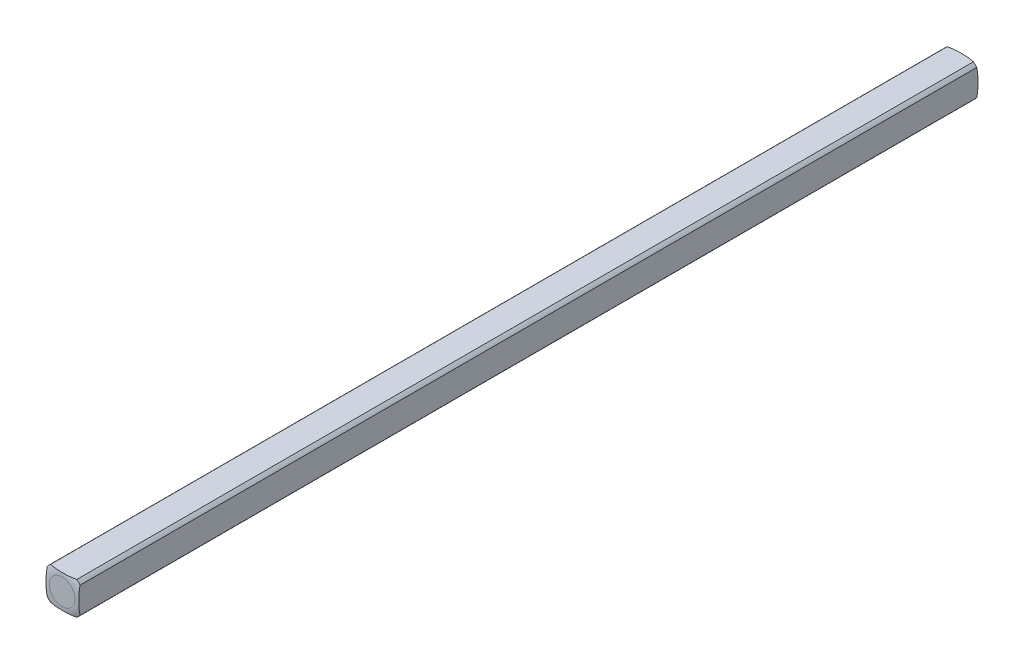
ISO-10303-21;
HEADER;
FILE_DESCRIPTION(('STEP AP214'),'2;1');
FILE_NAME('part.step','',(''),(''),'','','');
FILE_SCHEMA(('AUTOMOTIVE_DESIGN { 1 0 10303 214 1 1 1 1 }'));
ENDSEC;
DATA;
#1=APPLICATION_CONTEXT('core data for automotive mechanical design processes');
#2=APPLICATION_PROTOCOL_DEFINITION('international standard','automotive_design',2000,#1);
#3=PRODUCT_CONTEXT('',#1,'mechanical');
#4=PRODUCT('Part','Part','',(#3));
#5=PRODUCT_RELATED_PRODUCT_CATEGORY('part','',(#4));
#6=PRODUCT_DEFINITION_FORMATION('','',#4);
#7=PRODUCT_DEFINITION_CONTEXT('part definition',#1,'design');
#8=PRODUCT_DEFINITION('design','',#6,#7);
#9=PRODUCT_DEFINITION_SHAPE('','',#8);
#10=(LENGTH_UNIT() NAMED_UNIT(*) SI_UNIT(.MILLI.,.METRE.));
#11=(NAMED_UNIT(*) PLANE_ANGLE_UNIT() SI_UNIT($,.RADIAN.));
#12=(NAMED_UNIT(*) SI_UNIT($,.STERADIAN.) SOLID_ANGLE_UNIT());
#13=UNCERTAINTY_MEASURE_WITH_UNIT(LENGTH_MEASURE(1.E-05),#10,'distance_accuracy_value','');
#14=(GEOMETRIC_REPRESENTATION_CONTEXT(3) GLOBAL_UNCERTAINTY_ASSIGNED_CONTEXT((#13)) GLOBAL_UNIT_ASSIGNED_CONTEXT((#10,
#11,#12)) REPRESENTATION_CONTEXT('',''));
#15=CARTESIAN_POINT('',(0.,0.,0.));
#16=DIRECTION('',(0.,0.,1.));
#17=DIRECTION('',(1.,0.,0.));
#18=AXIS2_PLACEMENT_3D('',#15,#16,#17);
#19=CARTESIAN_POINT('',(-1.5875,-1.5875,43.561));
#20=DIRECTION('',(0.,1.,0.));
#21=DIRECTION('',(0.,0.,1.));
#22=AXIS2_PLACEMENT_3D('',#19,#20,#21);
#23=PLANE('',#22);
#24=CARTESIAN_POINT('',(1.26841150657032,-1.5875,-43.409919142098));
#25=CARTESIAN_POINT('',(1.22720105040827,-1.5875,-43.4201762604742));
#26=CARTESIAN_POINT('',(1.18578761357714,-1.5875,-43.4295927535058));
#27=CARTESIAN_POINT('',(1.10271120238514,-1.5875,-43.446861071626));
#28=CARTESIAN_POINT('',(1.06104879805324,-1.5875,-43.4547156312752));
#29=CARTESIAN_POINT('',(0.977511179219645,-1.5875,-43.4690074369776));
#30=CARTESIAN_POINT('',(0.935636116351978,-1.5875,-43.47544557827));
#31=CARTESIAN_POINT('',(0.85195632596747,-1.5875,-43.4870202217379));
#32=CARTESIAN_POINT('',(0.810152608329593,-1.5875,-43.4921640837943));
#33=CARTESIAN_POINT('',(0.726405135779092,-1.5875,-43.5013448983346));
#34=CARTESIAN_POINT('',(0.684461324130968,-1.5875,-43.5053813277516));
#35=CARTESIAN_POINT('',(0.600471089740472,-1.5875,-43.5124873965405));
#36=CARTESIAN_POINT('',(0.55842462478368,-1.5875,-43.5155565288188));
#37=CARTESIAN_POINT('',(0.442316252980614,-1.5875,-43.522876819996));
#38=CARTESIAN_POINT('',(0.368199297688235,-1.5875,-43.5262546095867));
#39=CARTESIAN_POINT('',(0.219899169562756,-1.5875,-43.5310241426145));
#40=CARTESIAN_POINT('',(0.145715990031034,-1.5875,-43.5324156550284));
#41=CARTESIAN_POINT('',(-0.00261925426802457,-1.5875,-43.5335115381934));
#42=CARTESIAN_POINT('',(-0.0767713119995583,-1.5875,-43.5332168909072));
#43=CARTESIAN_POINT('',(-0.225055834270109,-1.5875,-43.5308755268396));
#44=CARTESIAN_POINT('',(-0.299188296702211,-1.5875,-43.5288286662978));
#45=CARTESIAN_POINT('',(-0.448491393859349,-1.5875,-43.522519272075));
#46=CARTESIAN_POINT('',(-0.523660700911161,-1.5875,-43.5182235679572));
#47=CARTESIAN_POINT('',(-0.673772419103431,-1.5875,-43.5067011997426));
#48=CARTESIAN_POINT('',(-0.748714874122629,-1.5875,-43.4994751445196));
#49=CARTESIAN_POINT('',(-0.873294781040693,-1.5875,-43.4843054206116));
#50=CARTESIAN_POINT('',(-0.923058303404123,-1.5875,-43.4773998036191));
#51=CARTESIAN_POINT('',(-1.02230885751262,-1.5875,-43.4616736221696));
#52=CARTESIAN_POINT('',(-1.07179576173138,-1.5875,-43.4528522389467));
#53=CARTESIAN_POINT('',(-1.17042027552899,-1.5875,-43.4330571345187));
#54=CARTESIAN_POINT('',(-1.2195571747518,-1.58749999999998,-43.422079888906));
#55=CARTESIAN_POINT('',(-1.26841150657033,-1.58749999999996,-43.409919142098));
#56=B_SPLINE_CURVE_WITH_KNOTS('',3,(#24,#25,#26,#27,#28,#29,#30,#31,#32,#33,#34,#35,#36,#37,#38,
#39,#40,#41,#42,#43,#44,#45,#46,#47,#48,#49,#50,#51,#52,#53,#54,#55),.UNSPECIFIED.,.F.,.F.,(4,2,
2,2,2,2,2,2,2,2,2,2,2,2,2,4),(0.,0.12738566921495,0.254546315061894,0.381626357369329,
0.507966543484097,0.634366300757393,0.760832211740227,0.983375124489411,1.20594391900471,
1.42838311012148,1.65084055299026,1.87667574497213,2.10246403651328,2.25315484465145,
2.40391018266841,2.55491405868559),.UNSPECIFIED.);
#57=CARTESIAN_POINT('',(1.26841150657032,-1.5875,-43.409919142098));
#58=VERTEX_POINT('',#57);
#59=CARTESIAN_POINT('',(-1.26841150657032,-1.5875,-43.409919142098));
#60=VERTEX_POINT('',#59);
#61=EDGE_CURVE('E112',#58,#60,#56,.T.);
#62=ORIENTED_EDGE('',*,*,#61,.F.);
#63=DIRECTION('',(0.,0.,1.));
#64=VECTOR('',#63,1.);
#65=CARTESIAN_POINT('',(1.26841150657032,-1.5875,-43.561));
#66=LINE('',#65,#64);
#67=CARTESIAN_POINT('',(1.26841150657032,-1.5875,43.409919142098));
#68=VERTEX_POINT('',#67);
#69=EDGE_CURVE('E122',#68,#58,#66,.F.);
#70=ORIENTED_EDGE('',*,*,#69,.F.);
#71=CARTESIAN_POINT('',(-1.26841150657033,-1.5875,43.409919142098));
#72=CARTESIAN_POINT('',(-1.22720105040827,-1.5875,43.4201762604742));
#73=CARTESIAN_POINT('',(-1.18578761357714,-1.5875,43.4295927535058));
#74=CARTESIAN_POINT('',(-1.10271120238514,-1.5875,43.446861071626));
#75=CARTESIAN_POINT('',(-1.06104879805324,-1.5875,43.4547156312752));
#76=CARTESIAN_POINT('',(-0.977511179219641,-1.5875,43.4690074369776));
#77=CARTESIAN_POINT('',(-0.935636116351973,-1.5875,43.47544557827));
#78=CARTESIAN_POINT('',(-0.851956325967463,-1.5875,43.4870202217379));
#79=CARTESIAN_POINT('',(-0.810152608329585,-1.5875,43.4921640837943));
#80=CARTESIAN_POINT('',(-0.726405135779082,-1.5875,43.5013448983346));
#81=CARTESIAN_POINT('',(-0.684461324130958,-1.5875,43.5053813277516));
#82=CARTESIAN_POINT('',(-0.60047108974046,-1.5875,43.5124873965405));
#83=CARTESIAN_POINT('',(-0.558424624783667,-1.5875,43.5155565288188));
#84=CARTESIAN_POINT('',(-0.4423162529806,-1.5875,43.522876819996));
#85=CARTESIAN_POINT('',(-0.368199297688222,-1.5875,43.5262546095867));
#86=CARTESIAN_POINT('',(-0.219899169562744,-1.5875,43.5310241426145));
#87=CARTESIAN_POINT('',(-0.145715990031022,-1.5875,43.5324156550284));
#88=CARTESIAN_POINT('',(0.00261925426803485,-1.5875,43.5335115381934));
#89=CARTESIAN_POINT('',(0.076771311999568,-1.5875,43.5332168909073));
#90=CARTESIAN_POINT('',(0.225055834270118,-1.5875,43.5308755268396));
#91=CARTESIAN_POINT('',(0.299188296702219,-1.5875,43.5288286662978));
#92=CARTESIAN_POINT('',(0.448491393859357,-1.5875,43.522519272075));
#93=CARTESIAN_POINT('',(0.523660700911169,-1.5875,43.5182235679572));
#94=CARTESIAN_POINT('',(0.673772419103438,-1.5875,43.5067011997426));
#95=CARTESIAN_POINT('',(0.748714874122635,-1.5875,43.4994751445196));
#96=CARTESIAN_POINT('',(0.873294781040699,-1.5875,43.4843054206116));
#97=CARTESIAN_POINT('',(0.923058303404129,-1.5875,43.4773998036191));
#98=CARTESIAN_POINT('',(1.02230885751263,-1.5875,43.4616736221696));
#99=CARTESIAN_POINT('',(1.07179576173138,-1.5875,43.4528522389467));
#100=CARTESIAN_POINT('',(1.17042027552899,-1.5875,43.4330571345187));
#101=CARTESIAN_POINT('',(1.2195571747518,-1.58749999999998,43.422079888906));
#102=CARTESIAN_POINT('',(1.26841150657033,-1.58749999999996,43.409919142098));
#103=B_SPLINE_CURVE_WITH_KNOTS('',3,(#71,#72,#73,#74,#75,#76,#77,#78,#79,#80,#81,#82,#83,#84,
#85,#86,#87,#88,#89,#90,#91,#92,#93,#94,#95,#96,#97,#98,#99,#100,#101,#102),.UNSPECIFIED.,.F.,
.F.,(4,2,2,2,2,2,2,2,2,2,2,2,2,2,2,4),(0.,0.127385669214953,0.254546315061899,0.381626357369337,
0.507966543484108,0.634366300757407,0.760832211740243,0.983375124489425,1.20594391900472,
1.42838311012149,1.65084055299027,1.87667574497214,2.10246403651329,2.25315484465146,
2.40391018266842,2.55491405868559),.UNSPECIFIED.);
#104=CARTESIAN_POINT('',(-1.26841150657033,-1.5875,43.409919142098));
#105=VERTEX_POINT('',#104);
#106=EDGE_CURVE('E87',#105,#68,#103,.T.);
#107=ORIENTED_EDGE('',*,*,#106,.F.);
#108=DIRECTION('',(0.,0.,1.));
#109=VECTOR('',#108,1.);
#110=CARTESIAN_POINT('',(-1.26841150657032,-1.5875,-43.561));
#111=LINE('',#110,#109);
#112=EDGE_CURVE('E111',#60,#105,#111,.T.);
#113=ORIENTED_EDGE('',*,*,#112,.F.);
#114=EDGE_LOOP('',(#62,#70,#107,#113));
#115=FACE_BOUND('',#114,.T.);
#116=ADVANCED_FACE('F16',(#115),#23,.F.);
#117=CARTESIAN_POINT('',(0.,0.,-43.561));
#118=DIRECTION('',(0.,0.,1.));
#119=DIRECTION('',(1.,0.,0.));
#120=AXIS2_PLACEMENT_3D('',#117,#118,#119);
#121=CYLINDRICAL_SURFACE('',#120,2.032);
#122=CARTESIAN_POINT('',(0.,0.,43.409919142098));
#123=DIRECTION('',(0.,0.,1.));
#124=DIRECTION('',(1.,0.,0.));
#125=AXIS2_PLACEMENT_3D('',#122,#123,#124);
#126=CIRCLE('',#125,2.032);
#127=CARTESIAN_POINT('',(-1.5875,-1.26841150657032,43.409919142098));
#128=VERTEX_POINT('',#127);
#129=EDGE_CURVE('E96',#105,#128,#126,.F.);
#130=ORIENTED_EDGE('',*,*,#129,.T.);
#131=DIRECTION('',(0.,0.,-1.));
#132=VECTOR('',#131,1.);
#133=CARTESIAN_POINT('',(-1.5875,-1.26841150657032,43.561));
#134=LINE('',#133,#132);
#135=CARTESIAN_POINT('',(-1.5875,-1.26841150657032,-43.409919142098));
#136=VERTEX_POINT('',#135);
#137=EDGE_CURVE('E109',#128,#136,#134,.T.);
#138=ORIENTED_EDGE('',*,*,#137,.T.);
#139=CARTESIAN_POINT('',(0.,0.,-43.409919142098));
#140=DIRECTION('',(0.,0.,1.));
#141=DIRECTION('',(1.,0.,0.));
#142=AXIS2_PLACEMENT_3D('',#139,#140,#141);
#143=CIRCLE('',#142,2.032);
#144=EDGE_CURVE('E279',#60,#136,#143,.F.);
#145=ORIENTED_EDGE('',*,*,#144,.F.);
#146=ORIENTED_EDGE('',*,*,#112,.T.);
#147=EDGE_LOOP('',(#130,#138,#145,#146));
#148=FACE_BOUND('',#147,.T.);
#149=ADVANCED_FACE('F107',(#148),#121,.T.);
#150=CARTESIAN_POINT('',(0.,0.,-43.561));
#151=DIRECTION('',(0.,0.,1.));
#152=DIRECTION('',(1.,0.,0.));
#153=AXIS2_PLACEMENT_3D('',#150,#151,#152);
#154=CYLINDRICAL_SURFACE('',#153,2.032);
#155=CARTESIAN_POINT('',(0.,0.,43.409919142098));
#156=DIRECTION('',(0.,0.,1.));
#157=DIRECTION('',(1.,0.,0.));
#158=AXIS2_PLACEMENT_3D('',#155,#156,#157);
#159=CIRCLE('',#158,2.032);
#160=CARTESIAN_POINT('',(1.5875,-1.26841150657032,43.409919142098));
#161=VERTEX_POINT('',#160);
#162=EDGE_CURVE('E278',#161,#68,#159,.F.);
#163=ORIENTED_EDGE('',*,*,#162,.T.);
#164=ORIENTED_EDGE('',*,*,#69,.T.);
#165=CARTESIAN_POINT('',(0.,0.,-43.409919142098));
#166=DIRECTION('',(0.,0.,1.));
#167=DIRECTION('',(1.,0.,0.));
#168=AXIS2_PLACEMENT_3D('',#165,#166,#167);
#169=CIRCLE('',#168,2.032);
#170=CARTESIAN_POINT('',(1.5875,-1.26841150657032,-43.409919142098));
#171=VERTEX_POINT('',#170);
#172=EDGE_CURVE('E167',#58,#171,#169,.T.);
#173=ORIENTED_EDGE('',*,*,#172,.T.);
#174=DIRECTION('',(0.,0.,1.));
#175=VECTOR('',#174,1.);
#176=CARTESIAN_POINT('',(1.5875,-1.26841150657032,43.561));
#177=LINE('',#176,#175);
#178=EDGE_CURVE('E189',#171,#161,#177,.T.);
#179=ORIENTED_EDGE('',*,*,#178,.T.);
#180=EDGE_LOOP('',(#163,#164,#173,#179));
#181=FACE_BOUND('',#180,.T.);
#182=ADVANCED_FACE('F149',(#181),#154,.T.);
#183=CARTESIAN_POINT('',(-1.5875,1.5875,43.561));
#184=DIRECTION('',(0.,0.,-1.));
#185=DIRECTION('',(-1.,0.,0.));
#186=AXIS2_PLACEMENT_3D('',#183,#184,#185);
#187=PLANE('',#186);
#188=CARTESIAN_POINT('',(0.,0.,43.561));
#189=DIRECTION('',(0.,0.,-1.));
#190=DIRECTION('',(1.,0.,0.));
#191=AXIS2_PLACEMENT_3D('',#188,#189,#190);
#192=CIRCLE('',#191,1.24506403026729);
#193=CARTESIAN_POINT('',(1.24506403026729,0.,43.561));
#194=VERTEX_POINT('',#193);
#195=CARTESIAN_POINT('',(-1.24506403026729,0.,43.561));
#196=VERTEX_POINT('',#195);
#197=EDGE_CURVE('E117',#194,#196,#192,.T.);
#198=ORIENTED_EDGE('',*,*,#197,.F.);
#199=CARTESIAN_POINT('',(0.,0.,43.561));
#200=DIRECTION('',(0.,0.,-1.));
#201=DIRECTION('',(-1.,0.,0.));
#202=AXIS2_PLACEMENT_3D('',#199,#200,#201);
#203=CIRCLE('',#202,1.24506403026729);
#204=EDGE_CURVE('E163',#196,#194,#203,.T.);
#205=ORIENTED_EDGE('',*,*,#204,.F.);
#206=EDGE_LOOP('',(#198,#205));
#207=FACE_BOUND('',#206,.T.);
#208=ADVANCED_FACE('F139',(#207),#187,.F.);
#209=CARTESIAN_POINT('',(-1.5875,-1.5875,43.561));
#210=DIRECTION('',(1.,0.,0.));
#211=DIRECTION('',(0.,0.,-1.));
#212=AXIS2_PLACEMENT_3D('',#209,#210,#211);
#213=PLANE('',#212);
#214=CARTESIAN_POINT('',(-1.5875,-1.26841150657033,-43.409919142098));
#215=CARTESIAN_POINT('',(-1.5875,-1.1449330903041,-43.4406460633221));
#216=CARTESIAN_POINT('',(-1.5875,-1.01998399304383,-43.4637556661494));
#217=CARTESIAN_POINT('',(-1.5875,-0.768859486803924,-43.4985369425311));
#218=CARTESIAN_POINT('',(-1.5875,-0.642689416140629,-43.510245727962));
#219=CARTESIAN_POINT('',(-1.5875,-0.430424575859621,-43.5236252995166));
#220=CARTESIAN_POINT('',(-1.5875,-0.344419790998912,-43.5273089066951));
#221=CARTESIAN_POINT('',(-1.5875,-0.172275750609257,-43.5321119883047));
#222=CARTESIAN_POINT('',(-1.5875,-0.0861364440860028,-43.5332298028463));
#223=CARTESIAN_POINT('',(-1.5875,0.0708815141524196,-43.5332253528724));
#224=CARTESIAN_POINT('',(-1.5875,0.141761089973269,-43.5324647503116));
#225=CARTESIAN_POINT('',(-1.5875,0.283443517066233,-43.5292632283593));
#226=CARTESIAN_POINT('',(-1.5875,0.354246388904852,-43.5268233071219));
#227=CARTESIAN_POINT('',(-1.5875,0.495806846039993,-43.5198353290476));
#228=CARTESIAN_POINT('',(-1.5875,0.566564357181162,-43.5152856874328));
#229=CARTESIAN_POINT('',(-1.5875,0.707839358368325,-43.5034687398624));
#230=CARTESIAN_POINT('',(-1.5875,0.778356910390611,-43.4962021995255));
#231=CARTESIAN_POINT('',(-1.5875,0.919223859265381,-43.4782291029893));
#232=CARTESIAN_POINT('',(-1.5875,0.989571770847697,-43.4675104282261));
#233=CARTESIAN_POINT('',(-1.5875,1.12959917493506,-43.4419650360794));
#234=CARTESIAN_POINT('',(-1.5875,1.19927774910522,-43.4271333317905));
#235=CARTESIAN_POINT('',(-1.5875,1.26841150657032,-43.409919142098));
#236=B_SPLINE_CURVE_WITH_KNOTS('',3,(#214,#215,#216,#217,#218,#219,#220,#221,#222,#223,#224,
#225,#226,#227,#228,#229,#230,#231,#232,#233,#234,#235),.UNSPECIFIED.,.F.,.F.,(4,2,2,2,2,2,2,2,
2,2,4),(0.,0.380919121752896,0.760594090647793,1.01882661939087,1.27722615960104,
1.48986264420096,1.70237285085079,1.91504294996344,2.12765316402353,2.34101802413352,
2.55464272138866),.UNSPECIFIED.);
#237=CARTESIAN_POINT('',(-1.5875,1.26841150657032,-43.409919142098));
#238=VERTEX_POINT('',#237);
#239=EDGE_CURVE('E115',#136,#238,#236,.T.);
#240=ORIENTED_EDGE('',*,*,#239,.F.);
#241=ORIENTED_EDGE('',*,*,#137,.F.);
#242=CARTESIAN_POINT('',(-1.5875,1.26841150657033,43.409919142098));
#243=CARTESIAN_POINT('',(-1.5875,1.1449330903041,43.4406460633221));
#244=CARTESIAN_POINT('',(-1.5875,1.01998399304383,43.4637556661494));
#245=CARTESIAN_POINT('',(-1.5875,0.768859486803924,43.4985369425311));
#246=CARTESIAN_POINT('',(-1.5875,0.642689416140629,43.510245727962));
#247=CARTESIAN_POINT('',(-1.5875,0.430424575859621,43.5236252995166));
#248=CARTESIAN_POINT('',(-1.5875,0.344419790998912,43.5273089066951));
#249=CARTESIAN_POINT('',(-1.5875,0.172275750609257,43.5321119883047));
#250=CARTESIAN_POINT('',(-1.5875,0.0861364440860028,43.5332298028463));
#251=CARTESIAN_POINT('',(-1.5875,-0.0708815141524196,43.5332253528724));
#252=CARTESIAN_POINT('',(-1.5875,-0.141761089973269,43.5324647503116));
#253=CARTESIAN_POINT('',(-1.5875,-0.283443517066233,43.5292632283593));
#254=CARTESIAN_POINT('',(-1.5875,-0.354246388904852,43.5268233071219));
#255=CARTESIAN_POINT('',(-1.5875,-0.495806846039993,43.5198353290476));
#256=CARTESIAN_POINT('',(-1.5875,-0.566564357181162,43.5152856874328));
#257=CARTESIAN_POINT('',(-1.5875,-0.707839358368325,43.5034687398624));
#258=CARTESIAN_POINT('',(-1.5875,-0.778356910390611,43.4962021995255));
#259=CARTESIAN_POINT('',(-1.5875,-0.919223859265381,43.4782291029893));
#260=CARTESIAN_POINT('',(-1.5875,-0.989571770847697,43.4675104282261));
#261=CARTESIAN_POINT('',(-1.5875,-1.12959917493506,43.4419650360794));
#262=CARTESIAN_POINT('',(-1.5875,-1.19927774910522,43.4271333317905));
#263=CARTESIAN_POINT('',(-1.5875,-1.26841150657032,43.409919142098));
#264=B_SPLINE_CURVE_WITH_KNOTS('',3,(#242,#243,#244,#245,#246,#247,#248,#249,#250,#251,#252,
#253,#254,#255,#256,#257,#258,#259,#260,#261,#262,#263),.UNSPECIFIED.,.F.,.F.,(4,2,2,2,2,2,2,2,
2,2,4),(0.,0.380919121752896,0.760594090647793,1.01882661939087,1.27722615960104,
1.48986264420096,1.70237285085079,1.91504294996344,2.12765316402353,2.34101802413352,
2.55464272138866),.UNSPECIFIED.);
#265=CARTESIAN_POINT('',(-1.5875,1.26841150657032,43.409919142098));
#266=VERTEX_POINT('',#265);
#267=EDGE_CURVE('E92',#266,#128,#264,.T.);
#268=ORIENTED_EDGE('',*,*,#267,.F.);
#269=DIRECTION('',(0.,0.,1.));
#270=VECTOR('',#269,1.);
#271=CARTESIAN_POINT('',(-1.5875,1.26841150657032,-43.561));
#272=LINE('',#271,#270);
#273=EDGE_CURVE('E102',#238,#266,#272,.T.);
#274=ORIENTED_EDGE('',*,*,#273,.F.);
#275=EDGE_LOOP('',(#240,#241,#268,#274));
#276=FACE_BOUND('',#275,.T.);
#277=ADVANCED_FACE('F114',(#276),#213,.F.);
#278=CARTESIAN_POINT('',(-1.5875,1.5875,-43.561));
#279=DIRECTION('',(0.,0.,-1.));
#280=DIRECTION('',(-1.,0.,0.));
#281=AXIS2_PLACEMENT_3D('',#278,#279,#280);
#282=PLANE('',#281);
#283=CARTESIAN_POINT('',(0.,0.,-43.561));
#284=DIRECTION('',(0.,0.,1.));
#285=DIRECTION('',(1.,0.,0.));
#286=AXIS2_PLACEMENT_3D('',#283,#284,#285);
#287=CIRCLE('',#286,1.24506403026729);
#288=CARTESIAN_POINT('',(1.24506403026729,0.,-43.561));
#289=VERTEX_POINT('',#288);
#290=CARTESIAN_POINT('',(-1.24506403026729,0.,-43.561));
#291=VERTEX_POINT('',#290);
#292=EDGE_CURVE('E202',#289,#291,#287,.T.);
#293=ORIENTED_EDGE('',*,*,#292,.F.);
#294=CARTESIAN_POINT('',(0.,0.,-43.561));
#295=DIRECTION('',(0.,0.,1.));
#296=DIRECTION('',(-1.,0.,0.));
#297=AXIS2_PLACEMENT_3D('',#294,#295,#296);
#298=CIRCLE('',#297,1.24506403026729);
#299=EDGE_CURVE('E119',#289,#291,#298,.F.);
#300=ORIENTED_EDGE('',*,*,#299,.T.);
#301=EDGE_LOOP('',(#293,#300));
#302=FACE_BOUND('',#301,.T.);
#303=ADVANCED_FACE('F207',(#302),#282,.T.);
#304=CARTESIAN_POINT('',(1.5875,-1.5875,43.561));
#305=DIRECTION('',(-1.,0.,0.));
#306=DIRECTION('',(0.,0.,1.));
#307=AXIS2_PLACEMENT_3D('',#304,#305,#306);
#308=PLANE('',#307);
#309=ORIENTED_EDGE('',*,*,#178,.F.);
#310=CARTESIAN_POINT('',(1.5875,1.26841150657032,-43.409919142098));
#311=CARTESIAN_POINT('',(1.5875,1.1449330903041,-43.4406460633221));
#312=CARTESIAN_POINT('',(1.5875,1.01998399304383,-43.4637556661494));
#313=CARTESIAN_POINT('',(1.5875,0.768859486803922,-43.4985369425311));
#314=CARTESIAN_POINT('',(1.5875,0.642689416140627,-43.510245727962));
#315=CARTESIAN_POINT('',(1.5875,0.430424575859619,-43.5236252995166));
#316=CARTESIAN_POINT('',(1.5875,0.344419790998911,-43.5273089066951));
#317=CARTESIAN_POINT('',(1.5875,0.172275750609256,-43.5321119883047));
#318=CARTESIAN_POINT('',(1.5875,0.0861364440860028,-43.5332298028463));
#319=CARTESIAN_POINT('',(1.5875,-0.0708815141524195,-43.5332253528724));
#320=CARTESIAN_POINT('',(1.5875,-0.141761089973269,-43.5324647503116));
#321=CARTESIAN_POINT('',(1.5875,-0.283443517066232,-43.5292632283593));
#322=CARTESIAN_POINT('',(1.5875,-0.354246388904852,-43.5268233071219));
#323=CARTESIAN_POINT('',(1.5875,-0.495806846039993,-43.5198353290476));
#324=CARTESIAN_POINT('',(1.5875,-0.566564357181162,-43.5152856874328));
#325=CARTESIAN_POINT('',(1.5875,-0.707839358368325,-43.5034687398624));
#326=CARTESIAN_POINT('',(1.5875,-0.778356910390611,-43.4962021995255));
#327=CARTESIAN_POINT('',(1.5875,-0.919223859265382,-43.4782291029893));
#328=CARTESIAN_POINT('',(1.5875,-0.989571770847698,-43.4675104282261));
#329=CARTESIAN_POINT('',(1.5875,-1.12959917493506,-43.4419650360794));
#330=CARTESIAN_POINT('',(1.5875,-1.19927774910522,-43.4271333317905));
#331=CARTESIAN_POINT('',(1.5875,-1.26841150657033,-43.409919142098));
#332=B_SPLINE_CURVE_WITH_KNOTS('',3,(#310,#311,#312,#313,#314,#315,#316,#317,#318,#319,#320,
#321,#322,#323,#324,#325,#326,#327,#328,#329,#330,#331),.UNSPECIFIED.,.F.,.F.,(4,2,2,2,2,2,2,2,
2,2,4),(0.,0.380919121752896,0.760594090647793,1.01882661939087,1.27722615960104,
1.48986264420096,1.70237285085079,1.91504294996344,2.12765316402353,2.34101802413352,
2.55464272138867),.UNSPECIFIED.);
#333=CARTESIAN_POINT('',(1.5875,1.26841150657032,-43.409919142098));
#334=VERTEX_POINT('',#333);
#335=EDGE_CURVE('E230',#334,#171,#332,.T.);
#336=ORIENTED_EDGE('',*,*,#335,.F.);
#337=DIRECTION('',(0.,0.,1.));
#338=VECTOR('',#337,1.);
#339=CARTESIAN_POINT('',(1.5875,1.26841150657032,-43.561));
#340=LINE('',#339,#338);
#341=CARTESIAN_POINT('',(1.5875,1.26841150657032,43.409919142098));
#342=VERTEX_POINT('',#341);
#343=EDGE_CURVE('E192',#342,#334,#340,.F.);
#344=ORIENTED_EDGE('',*,*,#343,.F.);
#345=CARTESIAN_POINT('',(1.5875,-1.26841150657032,43.409919142098));
#346=CARTESIAN_POINT('',(1.5875,-1.1449330903041,43.4406460633221));
#347=CARTESIAN_POINT('',(1.5875,-1.01998399304383,43.4637556661494));
#348=CARTESIAN_POINT('',(1.5875,-0.768859486803923,43.4985369425311));
#349=CARTESIAN_POINT('',(1.5875,-0.642689416140627,43.510245727962));
#350=CARTESIAN_POINT('',(1.5875,-0.43042457585962,43.5236252995166));
#351=CARTESIAN_POINT('',(1.5875,-0.344419790998911,43.5273089066951));
#352=CARTESIAN_POINT('',(1.5875,-0.172275750609256,43.5321119883047));
#353=CARTESIAN_POINT('',(1.5875,-0.0861364440860027,43.5332298028463));
#354=CARTESIAN_POINT('',(1.5875,0.0708815141524194,43.5332253528724));
#355=CARTESIAN_POINT('',(1.5875,0.141761089973268,43.5324647503116));
#356=CARTESIAN_POINT('',(1.5875,0.283443517066233,43.5292632283593));
#357=CARTESIAN_POINT('',(1.5875,0.354246388904852,43.5268233071219));
#358=CARTESIAN_POINT('',(1.5875,0.495806846039993,43.5198353290476));
#359=CARTESIAN_POINT('',(1.5875,0.566564357181161,43.5152856874328));
#360=CARTESIAN_POINT('',(1.5875,0.707839358368325,43.5034687398624));
#361=CARTESIAN_POINT('',(1.5875,0.778356910390611,43.4962021995255));
#362=CARTESIAN_POINT('',(1.5875,0.919223859265381,43.4782291029893));
#363=CARTESIAN_POINT('',(1.5875,0.989571770847698,43.4675104282261));
#364=CARTESIAN_POINT('',(1.5875,1.12959917493506,43.4419650360794));
#365=CARTESIAN_POINT('',(1.5875,1.19927774910522,43.4271333317905));
#366=CARTESIAN_POINT('',(1.5875,1.26841150657033,43.409919142098));
#367=B_SPLINE_CURVE_WITH_KNOTS('',3,(#345,#346,#347,#348,#349,#350,#351,#352,#353,#354,#355,
#356,#357,#358,#359,#360,#361,#362,#363,#364,#365,#366),.UNSPECIFIED.,.F.,.F.,(4,2,2,2,2,2,2,2,
2,2,4),(0.,0.380919121752896,0.760594090647793,1.01882661939087,1.27722615960104,
1.48986264420096,1.70237285085079,1.91504294996344,2.12765316402353,2.34101802413352,
2.55464272138867),.UNSPECIFIED.);
#368=EDGE_CURVE('E103',#161,#342,#367,.T.);
#369=ORIENTED_EDGE('',*,*,#368,.F.);
#370=EDGE_LOOP('',(#309,#336,#344,#369));
#371=FACE_BOUND('',#370,.T.);
#372=ADVANCED_FACE('F180',(#371),#308,.F.);
#373=CARTESIAN_POINT('',(1.24506403026729,0.,41.436));
#374=DIRECTION('',(0.,-1.,0.));
#375=DIRECTION('',(1.,0.,0.));
#376=AXIS2_PLACEMENT_3D('',#373,#374,#375);
#377=CIRCLE('',#376,2.125);
#378=TRIMMED_CURVE('',#377,(PARAMETER_VALUE(-2.19680193092879)),
(PARAMETER_VALUE(2.19680193092879)),.T.,.PARAMETER.);
#379=CARTESIAN_POINT('',(0.,0.,41.436));
#380=DIRECTION('',(0.,0.,-1.));
#381=AXIS1_PLACEMENT('',#379,#380);
#382=SURFACE_OF_REVOLUTION('',#378,#381);
#383=ORIENTED_EDGE('',*,*,#267,.T.);
#384=ORIENTED_EDGE('',*,*,#129,.F.);
#385=ORIENTED_EDGE('',*,*,#106,.T.);
#386=ORIENTED_EDGE('',*,*,#162,.F.);
#387=ORIENTED_EDGE('',*,*,#368,.T.);
#388=CARTESIAN_POINT('',(0.,0.,43.409919142098));
#389=DIRECTION('',(0.,0.,1.));
#390=DIRECTION('',(1.,0.,0.));
#391=AXIS2_PLACEMENT_3D('',#388,#389,#390);
#392=CIRCLE('',#391,2.032);
#393=CARTESIAN_POINT('',(1.26841150657032,1.5875,43.409919142098));
#394=VERTEX_POINT('',#393);
#395=EDGE_CURVE('E195',#394,#342,#392,.F.);
#396=ORIENTED_EDGE('',*,*,#395,.F.);
#397=CARTESIAN_POINT('',(1.26841150657032,1.5875,43.409919142098));
#398=CARTESIAN_POINT('',(1.22720105040827,1.5875,43.4201762604742));
#399=CARTESIAN_POINT('',(1.18578761357714,1.5875,43.4295927535058));
#400=CARTESIAN_POINT('',(1.10271120238514,1.5875,43.446861071626));
#401=CARTESIAN_POINT('',(1.06104879805324,1.5875,43.4547156312752));
#402=CARTESIAN_POINT('',(0.977511179219645,1.5875,43.4690074369776));
#403=CARTESIAN_POINT('',(0.935636116351978,1.5875,43.47544557827));
#404=CARTESIAN_POINT('',(0.85195632596747,1.5875,43.4870202217379));
#405=CARTESIAN_POINT('',(0.810152608329593,1.5875,43.4921640837943));
#406=CARTESIAN_POINT('',(0.726405135779092,1.5875,43.5013448983346));
#407=CARTESIAN_POINT('',(0.684461324130968,1.5875,43.5053813277516));
#408=CARTESIAN_POINT('',(0.600471089740472,1.5875,43.5124873965405));
#409=CARTESIAN_POINT('',(0.55842462478368,1.5875,43.5155565288188));
#410=CARTESIAN_POINT('',(0.442316252980614,1.5875,43.522876819996));
#411=CARTESIAN_POINT('',(0.368199297688235,1.5875,43.5262546095867));
#412=CARTESIAN_POINT('',(0.219899169562756,1.5875,43.5310241426145));
#413=CARTESIAN_POINT('',(0.145715990031034,1.5875,43.5324156550284));
#414=CARTESIAN_POINT('',(-0.00261925426802457,1.5875,43.5335115381934));
#415=CARTESIAN_POINT('',(-0.0767713119995583,1.5875,43.5332168909072));
#416=CARTESIAN_POINT('',(-0.225055834270109,1.5875,43.5308755268396));
#417=CARTESIAN_POINT('',(-0.299188296702211,1.5875,43.5288286662978));
#418=CARTESIAN_POINT('',(-0.448491393859349,1.5875,43.522519272075));
#419=CARTESIAN_POINT('',(-0.523660700911161,1.5875,43.5182235679572));
#420=CARTESIAN_POINT('',(-0.673772419103431,1.5875,43.5067011997426));
#421=CARTESIAN_POINT('',(-0.748714874122629,1.5875,43.4994751445196));
#422=CARTESIAN_POINT('',(-0.873294781040693,1.5875,43.4843054206116));
#423=CARTESIAN_POINT('',(-0.923058303404123,1.5875,43.4773998036191));
#424=CARTESIAN_POINT('',(-1.02230885751262,1.5875,43.4616736221696));
#425=CARTESIAN_POINT('',(-1.07179576173138,1.5875,43.4528522389467));
#426=CARTESIAN_POINT('',(-1.17042027552899,1.5875,43.4330571345187));
#427=CARTESIAN_POINT('',(-1.2195571747518,1.58749999999998,43.422079888906));
#428=CARTESIAN_POINT('',(-1.26841150657033,1.58749999999996,43.409919142098));
#429=B_SPLINE_CURVE_WITH_KNOTS('',3,(#397,#398,#399,#400,#401,#402,#403,#404,#405,#406,#407,
#408,#409,#410,#411,#412,#413,#414,#415,#416,#417,#418,#419,#420,#421,#422,#423,#424,#425,#426,
#427,#428),.UNSPECIFIED.,.F.,.F.,(4,2,2,2,2,2,2,2,2,2,2,2,2,2,2,4),(0.,0.12738566921495,
0.254546315061894,0.381626357369329,0.507966543484097,0.634366300757393,0.760832211740227,
0.983375124489411,1.20594391900471,1.42838311012148,1.65084055299026,1.87667574497213,
2.10246403651328,2.25315484465145,2.40391018266841,2.55491405868559),.UNSPECIFIED.);
#430=CARTESIAN_POINT('',(-1.26841150657032,1.5875,43.409919142098));
#431=VERTEX_POINT('',#430);
#432=EDGE_CURVE('E194',#394,#431,#429,.T.);
#433=ORIENTED_EDGE('',*,*,#432,.T.);
#434=CARTESIAN_POINT('',(0.,0.,43.409919142098));
#435=DIRECTION('',(0.,0.,1.));
#436=DIRECTION('',(1.,0.,0.));
#437=AXIS2_PLACEMENT_3D('',#434,#435,#436);
#438=CIRCLE('',#437,2.032);
#439=EDGE_CURVE('E98',#266,#431,#438,.F.);
#440=ORIENTED_EDGE('',*,*,#439,.F.);
#441=EDGE_LOOP('',(#383,#384,#385,#386,#387,#396,#433,#440));
#442=FACE_BOUND('',#441,.T.);
#443=ORIENTED_EDGE('',*,*,#197,.T.);
#444=ORIENTED_EDGE('',*,*,#204,.T.);
#445=EDGE_LOOP('',(#443,#444));
#446=FACE_BOUND('',#445,.T.);
#447=ADVANCED_FACE('F94',(#442,#446),#382,.F.);
#448=CARTESIAN_POINT('',(0.,0.,-43.561));
#449=DIRECTION('',(0.,0.,1.));
#450=DIRECTION('',(1.,0.,0.));
#451=AXIS2_PLACEMENT_3D('',#448,#449,#450);
#452=CYLINDRICAL_SURFACE('',#451,2.032);
#453=ORIENTED_EDGE('',*,*,#439,.T.);
#454=DIRECTION('',(0.,0.,-1.));
#455=VECTOR('',#454,1.);
#456=CARTESIAN_POINT('',(-1.26841150657032,1.5875,43.561));
#457=LINE('',#456,#455);
#458=CARTESIAN_POINT('',(-1.26841150657032,1.5875,-43.409919142098));
#459=VERTEX_POINT('',#458);
#460=EDGE_CURVE('E235',#431,#459,#457,.T.);
#461=ORIENTED_EDGE('',*,*,#460,.T.);
#462=CARTESIAN_POINT('',(0.,0.,-43.409919142098));
#463=DIRECTION('',(0.,0.,1.));
#464=DIRECTION('',(1.,0.,0.));
#465=AXIS2_PLACEMENT_3D('',#462,#463,#464);
#466=CIRCLE('',#465,2.032);
#467=EDGE_CURVE('E229',#238,#459,#466,.F.);
#468=ORIENTED_EDGE('',*,*,#467,.F.);
#469=ORIENTED_EDGE('',*,*,#273,.T.);
#470=EDGE_LOOP('',(#453,#461,#468,#469));
#471=FACE_BOUND('',#470,.T.);
#472=ADVANCED_FACE('F179',(#471),#452,.T.);
#473=CARTESIAN_POINT('',(1.24506403026729,0.,-41.436));
#474=DIRECTION('',(0.,1.,0.));
#475=DIRECTION('',(1.,0.,0.));
#476=AXIS2_PLACEMENT_3D('',#473,#474,#475);
#477=CIRCLE('',#476,2.125);
#478=TRIMMED_CURVE('',#477,(PARAMETER_VALUE(-2.19680193092879)),
(PARAMETER_VALUE(2.19680193092879)),.T.,.PARAMETER.);
#479=CARTESIAN_POINT('',(0.,0.,-41.436));
#480=DIRECTION('',(0.,0.,1.));
#481=AXIS1_PLACEMENT('',#479,#480);
#482=SURFACE_OF_REVOLUTION('',#478,#481);
#483=ORIENTED_EDGE('',*,*,#292,.T.);
#484=ORIENTED_EDGE('',*,*,#299,.F.);
#485=EDGE_LOOP('',(#483,#484));
#486=FACE_BOUND('',#485,.T.);
#487=ORIENTED_EDGE('',*,*,#335,.T.);
#488=ORIENTED_EDGE('',*,*,#172,.F.);
#489=ORIENTED_EDGE('',*,*,#61,.T.);
#490=ORIENTED_EDGE('',*,*,#144,.T.);
#491=ORIENTED_EDGE('',*,*,#239,.T.);
#492=ORIENTED_EDGE('',*,*,#467,.T.);
#493=CARTESIAN_POINT('',(-1.26841150657033,1.5875,-43.409919142098));
#494=CARTESIAN_POINT('',(-1.22720105040827,1.5875,-43.4201762604742));
#495=CARTESIAN_POINT('',(-1.18578761357714,1.5875,-43.4295927535058));
#496=CARTESIAN_POINT('',(-1.10271120238514,1.5875,-43.446861071626));
#497=CARTESIAN_POINT('',(-1.06104879805324,1.5875,-43.4547156312752));
#498=CARTESIAN_POINT('',(-0.977511179219641,1.5875,-43.4690074369776));
#499=CARTESIAN_POINT('',(-0.935636116351973,1.5875,-43.47544557827));
#500=CARTESIAN_POINT('',(-0.851956325967463,1.5875,-43.4870202217379));
#501=CARTESIAN_POINT('',(-0.810152608329585,1.5875,-43.4921640837943));
#502=CARTESIAN_POINT('',(-0.726405135779082,1.5875,-43.5013448983346));
#503=CARTESIAN_POINT('',(-0.684461324130957,1.5875,-43.5053813277516));
#504=CARTESIAN_POINT('',(-0.600471089740459,1.5875,-43.5124873965405));
#505=CARTESIAN_POINT('',(-0.558424624783666,1.5875,-43.5155565288188));
#506=CARTESIAN_POINT('',(-0.4423162529806,1.5875,-43.522876819996));
#507=CARTESIAN_POINT('',(-0.368199297688221,1.5875,-43.5262546095867));
#508=CARTESIAN_POINT('',(-0.219899169562744,1.5875,-43.5310241426145));
#509=CARTESIAN_POINT('',(-0.145715990031022,1.5875,-43.5324156550284));
#510=CARTESIAN_POINT('',(0.00261925426803493,1.5875,-43.5335115381934));
#511=CARTESIAN_POINT('',(0.0767713119995681,1.5875,-43.5332168909073));
#512=CARTESIAN_POINT('',(0.225055834270118,1.5875,-43.5308755268396));
#513=CARTESIAN_POINT('',(0.299188296702219,1.5875,-43.5288286662978));
#514=CARTESIAN_POINT('',(0.448491393859357,1.5875,-43.522519272075));
#515=CARTESIAN_POINT('',(0.523660700911169,1.5875,-43.5182235679572));
#516=CARTESIAN_POINT('',(0.673772419103438,1.5875,-43.5067011997426));
#517=CARTESIAN_POINT('',(0.748714874122635,1.5875,-43.4994751445196));
#518=CARTESIAN_POINT('',(0.873294781040699,1.5875,-43.4843054206116));
#519=CARTESIAN_POINT('',(0.923058303404129,1.5875,-43.4773998036191));
#520=CARTESIAN_POINT('',(1.02230885751263,1.5875,-43.4616736221696));
#521=CARTESIAN_POINT('',(1.07179576173138,1.5875,-43.4528522389467));
#522=CARTESIAN_POINT('',(1.17042027552899,1.5875,-43.4330571345187));
#523=CARTESIAN_POINT('',(1.2195571747518,1.58749999999998,-43.422079888906));
#524=CARTESIAN_POINT('',(1.26841150657033,1.58749999999996,-43.409919142098));
#525=B_SPLINE_CURVE_WITH_KNOTS('',3,(#493,#494,#495,#496,#497,#498,#499,#500,#501,#502,#503,
#504,#505,#506,#507,#508,#509,#510,#511,#512,#513,#514,#515,#516,#517,#518,#519,#520,#521,#522,
#523,#524),.UNSPECIFIED.,.F.,.F.,(4,2,2,2,2,2,2,2,2,2,2,2,2,2,2,4),(0.,0.127385669214953,
0.254546315061899,0.381626357369337,0.507966543484108,0.634366300757407,0.760832211740243,
0.983375124489425,1.20594391900472,1.42838311012149,1.65084055299027,1.87667574497214,
2.10246403651328,2.25315484465146,2.40391018266842,2.55491405868559),.UNSPECIFIED.);
#526=CARTESIAN_POINT('',(1.26841150657032,1.5875,-43.409919142098));
#527=VERTEX_POINT('',#526);
#528=EDGE_CURVE('E28',#459,#527,#525,.T.);
#529=ORIENTED_EDGE('',*,*,#528,.T.);
#530=CARTESIAN_POINT('',(0.,0.,-43.409919142098));
#531=DIRECTION('',(0.,0.,1.));
#532=DIRECTION('',(1.,0.,0.));
#533=AXIS2_PLACEMENT_3D('',#530,#531,#532);
#534=CIRCLE('',#533,2.032);
#535=EDGE_CURVE('E36',#334,#527,#534,.T.);
#536=ORIENTED_EDGE('',*,*,#535,.F.);
#537=EDGE_LOOP('',(#487,#488,#489,#490,#491,#492,#529,#536));
#538=FACE_BOUND('',#537,.T.);
#539=ADVANCED_FACE('F225',(#486,#538),#482,.F.);
#540=CARTESIAN_POINT('',(0.,0.,-43.561));
#541=DIRECTION('',(0.,0.,1.));
#542=DIRECTION('',(1.,0.,0.));
#543=AXIS2_PLACEMENT_3D('',#540,#541,#542);
#544=CYLINDRICAL_SURFACE('',#543,2.032);
#545=ORIENTED_EDGE('',*,*,#395,.T.);
#546=ORIENTED_EDGE('',*,*,#343,.T.);
#547=ORIENTED_EDGE('',*,*,#535,.T.);
#548=DIRECTION('',(0.,0.,-1.));
#549=VECTOR('',#548,1.);
#550=CARTESIAN_POINT('',(1.26841150657032,1.5875,43.561));
#551=LINE('',#550,#549);
#552=EDGE_CURVE('E11',#527,#394,#551,.F.);
#553=ORIENTED_EDGE('',*,*,#552,.T.);
#554=EDGE_LOOP('',(#545,#546,#547,#553));
#555=FACE_BOUND('',#554,.T.);
#556=ADVANCED_FACE('F259',(#555),#544,.T.);
#557=CARTESIAN_POINT('',(-1.5875,1.5875,43.561));
#558=DIRECTION('',(0.,-1.,0.));
#559=DIRECTION('',(0.,0.,-1.));
#560=AXIS2_PLACEMENT_3D('',#557,#558,#559);
#561=PLANE('',#560);
#562=ORIENTED_EDGE('',*,*,#528,.F.);
#563=ORIENTED_EDGE('',*,*,#460,.F.);
#564=ORIENTED_EDGE('',*,*,#432,.F.);
#565=ORIENTED_EDGE('',*,*,#552,.F.);
#566=EDGE_LOOP('',(#562,#563,#564,#565));
#567=FACE_BOUND('',#566,.T.);
#568=ADVANCED_FACE('F238',(#567),#561,.F.);
#569=CLOSED_SHELL('',(#116,#149,#182,#208,#277,#303,#372,#447,#472,#539,#556,#568));
#570=MANIFOLD_SOLID_BREP('B1',#569);
#571=ADVANCED_BREP_SHAPE_REPRESENTATION('',(#18,#570),#14);
#572=SHAPE_DEFINITION_REPRESENTATION(#9,#571);
ENDSEC;
END-ISO-10303-21;
